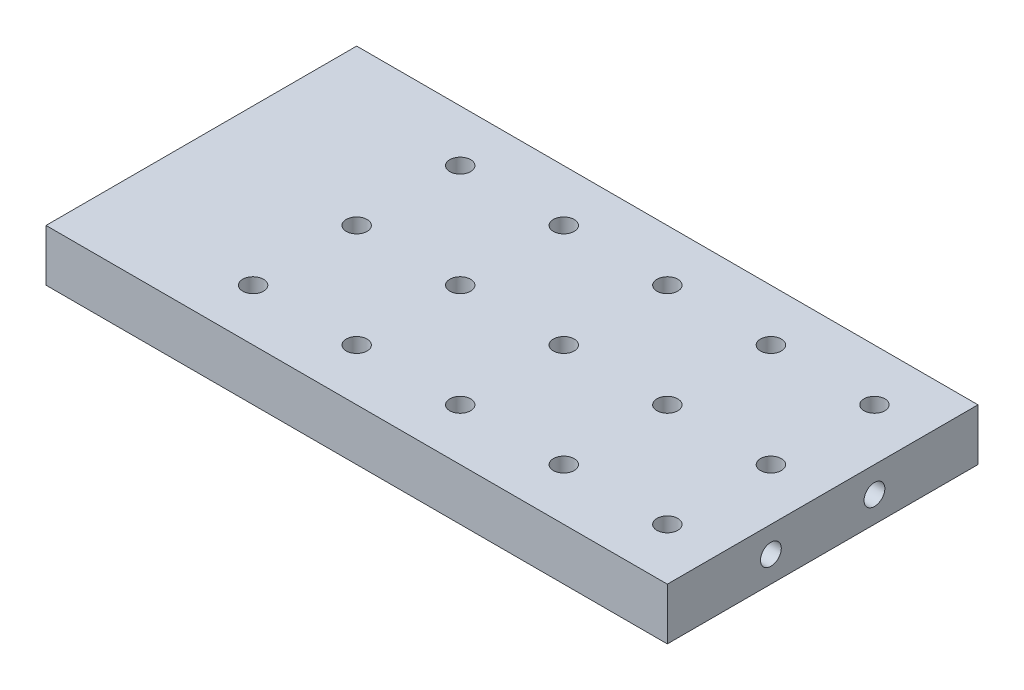
ISO-10303-21;
HEADER;
FILE_DESCRIPTION(('STEP AP214'),'2;1');
FILE_NAME('part.step','',(''),(''),'','','');
FILE_SCHEMA(('AUTOMOTIVE_DESIGN { 1 0 10303 214 1 1 1 1 }'));
ENDSEC;
DATA;
#1=APPLICATION_CONTEXT('core data for automotive mechanical design processes');
#2=APPLICATION_PROTOCOL_DEFINITION('international standard','automotive_design',2000,#1);
#3=PRODUCT_CONTEXT('',#1,'mechanical');
#4=PRODUCT('Part','Part','',(#3));
#5=PRODUCT_RELATED_PRODUCT_CATEGORY('part','',(#4));
#6=PRODUCT_DEFINITION_FORMATION('','',#4);
#7=PRODUCT_DEFINITION_CONTEXT('part definition',#1,'design');
#8=PRODUCT_DEFINITION('design','',#6,#7);
#9=PRODUCT_DEFINITION_SHAPE('','',#8);
#10=(LENGTH_UNIT() NAMED_UNIT(*) SI_UNIT(.MILLI.,.METRE.));
#11=(NAMED_UNIT(*) PLANE_ANGLE_UNIT() SI_UNIT($,.RADIAN.));
#12=(NAMED_UNIT(*) SI_UNIT($,.STERADIAN.) SOLID_ANGLE_UNIT());
#13=UNCERTAINTY_MEASURE_WITH_UNIT(LENGTH_MEASURE(1.E-05),#10,'distance_accuracy_value','');
#14=(GEOMETRIC_REPRESENTATION_CONTEXT(3) GLOBAL_UNCERTAINTY_ASSIGNED_CONTEXT((#13)) GLOBAL_UNIT_ASSIGNED_CONTEXT((#10,
#11,#12)) REPRESENTATION_CONTEXT('',''));
#15=CARTESIAN_POINT('',(0.,0.,0.));
#16=DIRECTION('',(0.,0.,1.));
#17=DIRECTION('',(1.,0.,0.));
#18=AXIS2_PLACEMENT_3D('',#15,#16,#17);
#19=CARTESIAN_POINT('',(0.,6.35,0.));
#20=DIRECTION('',(0.,-1.,0.));
#21=DIRECTION('',(0.,0.,-1.));
#22=AXIS2_PLACEMENT_3D('',#19,#20,#21);
#23=PLANE('',#22);
#24=CARTESIAN_POINT('',(63.5,6.35,-25.4));
#25=DIRECTION('',(0.,1.,0.));
#26=DIRECTION('',(0.,0.,1.));
#27=AXIS2_PLACEMENT_3D('',#24,#25,#26);
#28=CIRCLE('',#27,2.55270000000001);
#29=CARTESIAN_POINT('',(63.5,6.35,-22.8473));
#30=VERTEX_POINT('',#29);
#31=EDGE_CURVE('E133',#30,#30,#28,.T.);
#32=ORIENTED_EDGE('',*,*,#31,.F.);
#33=EDGE_LOOP('',(#32));
#34=FACE_BOUND('',#33,.T.);
#35=CARTESIAN_POINT('',(38.1,6.35,-25.3999999999998));
#36=DIRECTION('',(0.,1.,0.));
#37=DIRECTION('',(0.,0.,1.));
#38=AXIS2_PLACEMENT_3D('',#35,#36,#37);
#39=CIRCLE('',#38,2.5527);
#40=CARTESIAN_POINT('',(38.1,6.35,-22.8472999999998));
#41=VERTEX_POINT('',#40);
#42=EDGE_CURVE('E139',#41,#41,#39,.T.);
#43=ORIENTED_EDGE('',*,*,#42,.F.);
#44=EDGE_LOOP('',(#43));
#45=FACE_BOUND('',#44,.T.);
#46=CARTESIAN_POINT('',(12.7,6.35,-25.3999999999996));
#47=DIRECTION('',(0.,1.,0.));
#48=DIRECTION('',(0.,0.,1.));
#49=AXIS2_PLACEMENT_3D('',#46,#47,#48);
#50=CIRCLE('',#49,2.5527);
#51=CARTESIAN_POINT('',(12.7,6.35,-22.8472999999996));
#52=VERTEX_POINT('',#51);
#53=EDGE_CURVE('E145',#52,#52,#50,.T.);
#54=ORIENTED_EDGE('',*,*,#53,.F.);
#55=EDGE_LOOP('',(#54));
#56=FACE_BOUND('',#55,.T.);
#57=CARTESIAN_POINT('',(38.1000000000003,6.35,1.76941794549634E-13));
#58=DIRECTION('',(0.,1.,0.));
#59=DIRECTION('',(0.,0.,1.));
#60=AXIS2_PLACEMENT_3D('',#57,#58,#59);
#61=CIRCLE('',#60,2.5527);
#62=CARTESIAN_POINT('',(38.1000000000003,6.35,2.55270000000018));
#63=VERTEX_POINT('',#62);
#64=EDGE_CURVE('E151',#63,#63,#61,.T.);
#65=ORIENTED_EDGE('',*,*,#64,.F.);
#66=EDGE_LOOP('',(#65));
#67=FACE_BOUND('',#66,.T.);
#68=CARTESIAN_POINT('',(12.7000000000003,6.35,3.53883589099269E-13));
#69=DIRECTION('',(0.,1.,0.));
#70=DIRECTION('',(0.,0.,1.));
#71=AXIS2_PLACEMENT_3D('',#68,#69,#70);
#72=CIRCLE('',#71,2.5527);
#73=CARTESIAN_POINT('',(12.7000000000003,6.35,2.55270000000035));
#74=VERTEX_POINT('',#73);
#75=EDGE_CURVE('E157',#74,#74,#72,.T.);
#76=ORIENTED_EDGE('',*,*,#75,.F.);
#77=EDGE_LOOP('',(#76));
#78=FACE_BOUND('',#77,.T.);
#79=CARTESIAN_POINT('',(38.1000000000005,6.35,25.4000000000002));
#80=DIRECTION('',(0.,1.,0.));
#81=DIRECTION('',(0.,0.,1.));
#82=AXIS2_PLACEMENT_3D('',#79,#80,#81);
#83=CIRCLE('',#82,2.5527);
#84=CARTESIAN_POINT('',(38.1000000000005,6.35,27.9527000000002));
#85=VERTEX_POINT('',#84);
#86=EDGE_CURVE('E163',#85,#85,#83,.T.);
#87=ORIENTED_EDGE('',*,*,#86,.F.);
#88=EDGE_LOOP('',(#87));
#89=FACE_BOUND('',#88,.T.);
#90=CARTESIAN_POINT('',(12.7000000000005,6.35,25.4000000000004));
#91=DIRECTION('',(0.,1.,0.));
#92=DIRECTION('',(0.,0.,1.));
#93=AXIS2_PLACEMENT_3D('',#90,#91,#92);
#94=CIRCLE('',#93,2.5527);
#95=CARTESIAN_POINT('',(12.7000000000005,6.35,27.9527000000004));
#96=VERTEX_POINT('',#95);
#97=EDGE_CURVE('E169',#96,#96,#94,.T.);
#98=ORIENTED_EDGE('',*,*,#97,.F.);
#99=EDGE_LOOP('',(#98));
#100=FACE_BOUND('',#99,.T.);
#101=CARTESIAN_POINT('',(63.5000000000002,6.35,0.));
#102=DIRECTION('',(0.,1.,0.));
#103=DIRECTION('',(0.,0.,1.));
#104=AXIS2_PLACEMENT_3D('',#101,#102,#103);
#105=CIRCLE('',#104,2.55270000000001);
#106=CARTESIAN_POINT('',(63.5000000000002,6.35,2.55270000000001));
#107=VERTEX_POINT('',#106);
#108=EDGE_CURVE('E175',#107,#107,#105,.T.);
#109=ORIENTED_EDGE('',*,*,#108,.F.);
#110=EDGE_LOOP('',(#109));
#111=FACE_BOUND('',#110,.T.);
#112=CARTESIAN_POINT('',(63.5000000000005,6.35,25.4));
#113=DIRECTION('',(0.,1.,0.));
#114=DIRECTION('',(0.,0.,1.));
#115=AXIS2_PLACEMENT_3D('',#112,#113,#114);
#116=CIRCLE('',#115,2.55270000000001);
#117=CARTESIAN_POINT('',(63.5000000000005,6.35,27.9527));
#118=VERTEX_POINT('',#117);
#119=EDGE_CURVE('E181',#118,#118,#116,.T.);
#120=ORIENTED_EDGE('',*,*,#119,.F.);
#121=EDGE_LOOP('',(#120));
#122=FACE_BOUND('',#121,.T.);
#123=CARTESIAN_POINT('',(-12.7,6.35,-25.3999999999995));
#124=DIRECTION('',(0.,1.,0.));
#125=DIRECTION('',(0.,0.,1.));
#126=AXIS2_PLACEMENT_3D('',#123,#124,#125);
#127=CIRCLE('',#126,2.5527);
#128=CARTESIAN_POINT('',(-12.7,6.35,-22.8472999999995));
#129=VERTEX_POINT('',#128);
#130=EDGE_CURVE('E187',#129,#129,#127,.T.);
#131=ORIENTED_EDGE('',*,*,#130,.F.);
#132=EDGE_LOOP('',(#131));
#133=FACE_BOUND('',#132,.T.);
#134=CARTESIAN_POINT('',(-12.6999999999997,6.35,5.30825383648903E-13));
#135=DIRECTION('',(0.,1.,0.));
#136=DIRECTION('',(0.,0.,1.));
#137=AXIS2_PLACEMENT_3D('',#134,#135,#136);
#138=CIRCLE('',#137,2.5527);
#139=CARTESIAN_POINT('',(-12.6999999999997,6.35,2.55270000000053));
#140=VERTEX_POINT('',#139);
#141=EDGE_CURVE('E199',#140,#140,#138,.T.);
#142=ORIENTED_EDGE('',*,*,#141,.F.);
#143=EDGE_LOOP('',(#142));
#144=FACE_BOUND('',#143,.T.);
#145=CARTESIAN_POINT('',(-38.0999999999997,6.35,7.07767178198537E-13));
#146=DIRECTION('',(0.,1.,0.));
#147=DIRECTION('',(0.,0.,1.));
#148=AXIS2_PLACEMENT_3D('',#145,#146,#147);
#149=CIRCLE('',#148,2.5527);
#150=CARTESIAN_POINT('',(-38.0999999999997,6.35,2.55270000000071));
#151=VERTEX_POINT('',#150);
#152=EDGE_CURVE('E205',#151,#151,#149,.T.);
#153=ORIENTED_EDGE('',*,*,#152,.F.);
#154=EDGE_LOOP('',(#153));
#155=FACE_BOUND('',#154,.T.);
#156=CARTESIAN_POINT('',(-12.6999999999995,6.35,25.4000000000005));
#157=DIRECTION('',(0.,1.,0.));
#158=DIRECTION('',(0.,0.,1.));
#159=AXIS2_PLACEMENT_3D('',#156,#157,#158);
#160=CIRCLE('',#159,2.5527);
#161=CARTESIAN_POINT('',(-12.6999999999995,6.35,27.9527000000005));
#162=VERTEX_POINT('',#161);
#163=EDGE_CURVE('E211',#162,#162,#160,.T.);
#164=ORIENTED_EDGE('',*,*,#163,.F.);
#165=EDGE_LOOP('',(#164));
#166=FACE_BOUND('',#165,.T.);
#167=CARTESIAN_POINT('',(-38.0999999999995,6.35,25.4000000000007));
#168=DIRECTION('',(0.,1.,0.));
#169=DIRECTION('',(0.,0.,1.));
#170=AXIS2_PLACEMENT_3D('',#167,#168,#169);
#171=CIRCLE('',#170,2.5527);
#172=CARTESIAN_POINT('',(-38.0999999999995,6.35,27.9527000000007));
#173=VERTEX_POINT('',#172);
#174=EDGE_CURVE('E217',#173,#173,#171,.T.);
#175=ORIENTED_EDGE('',*,*,#174,.F.);
#176=EDGE_LOOP('',(#175));
#177=FACE_BOUND('',#176,.T.);
#178=DIRECTION('',(0.,0.,-1.));
#179=VECTOR('',#178,1.);
#180=CARTESIAN_POINT('',(76.2,6.35,38.1));
#181=LINE('',#180,#179);
#182=CARTESIAN_POINT('',(76.2,6.35,38.1));
#183=VERTEX_POINT('',#182);
#184=CARTESIAN_POINT('',(76.2,6.35,-38.1));
#185=VERTEX_POINT('',#184);
#186=EDGE_CURVE('E224',#183,#185,#181,.T.);
#187=ORIENTED_EDGE('',*,*,#186,.T.);
#188=DIRECTION('',(-1.,0.,0.));
#189=VECTOR('',#188,1.);
#190=CARTESIAN_POINT('',(-76.2,6.35,-38.1));
#191=LINE('',#190,#189);
#192=CARTESIAN_POINT('',(-76.2,6.35,-38.1));
#193=VERTEX_POINT('',#192);
#194=EDGE_CURVE('E78',#185,#193,#191,.T.);
#195=ORIENTED_EDGE('',*,*,#194,.T.);
#196=DIRECTION('',(0.,0.,1.));
#197=VECTOR('',#196,1.);
#198=CARTESIAN_POINT('',(-76.2,6.35,38.1));
#199=LINE('',#198,#197);
#200=CARTESIAN_POINT('',(-76.2,6.35,38.1));
#201=VERTEX_POINT('',#200);
#202=EDGE_CURVE('E227',#193,#201,#199,.T.);
#203=ORIENTED_EDGE('',*,*,#202,.T.);
#204=DIRECTION('',(1.,0.,0.));
#205=VECTOR('',#204,1.);
#206=CARTESIAN_POINT('',(-76.2,6.35,38.1));
#207=LINE('',#206,#205);
#208=EDGE_CURVE('E47',#201,#183,#207,.T.);
#209=ORIENTED_EDGE('',*,*,#208,.T.);
#210=EDGE_LOOP('',(#187,#195,#203,#209));
#211=FACE_BOUND('',#210,.T.);
#212=CARTESIAN_POINT('',(-38.1,6.35,-25.3999999999993));
#213=DIRECTION('',(0.,1.,0.));
#214=DIRECTION('',(0.,0.,1.));
#215=AXIS2_PLACEMENT_3D('',#212,#213,#214);
#216=CIRCLE('',#215,2.5527);
#217=CARTESIAN_POINT('',(-38.1,6.35,-22.8472999999993));
#218=VERTEX_POINT('',#217);
#219=EDGE_CURVE('E193',#218,#218,#216,.T.);
#220=ORIENTED_EDGE('',*,*,#219,.F.);
#221=EDGE_LOOP('',(#220));
#222=FACE_BOUND('',#221,.T.);
#223=ADVANCED_FACE('F30',(#34,#45,#56,#67,#78,#89,#100,#111,#122,#133,#144,#155,#166,#177,#211,
#222),#23,.F.);
#224=CARTESIAN_POINT('',(76.2,6.35,38.1));
#225=DIRECTION('',(-1.,0.,0.));
#226=DIRECTION('',(0.,0.,1.));
#227=AXIS2_PLACEMENT_3D('',#224,#225,#226);
#228=PLANE('',#227);
#229=CARTESIAN_POINT('',(76.2,0.,-12.7));
#230=DIRECTION('',(1.,0.,0.));
#231=DIRECTION('',(0.,0.,-1.));
#232=AXIS2_PLACEMENT_3D('',#229,#230,#231);
#233=CIRCLE('',#232,2.55269999999999);
#234=CARTESIAN_POINT('',(76.2,0.,-15.2527));
#235=VERTEX_POINT('',#234);
#236=EDGE_CURVE('E105',#235,#235,#233,.T.);
#237=ORIENTED_EDGE('',*,*,#236,.F.);
#238=EDGE_LOOP('',(#237));
#239=FACE_BOUND('',#238,.T.);
#240=CARTESIAN_POINT('',(76.2,0.,12.7));
#241=DIRECTION('',(1.,0.,0.));
#242=DIRECTION('',(0.,0.,-1.));
#243=AXIS2_PLACEMENT_3D('',#240,#241,#242);
#244=CIRCLE('',#243,2.55269999999999);
#245=CARTESIAN_POINT('',(76.2,0.,10.1473));
#246=VERTEX_POINT('',#245);
#247=EDGE_CURVE('E104',#246,#246,#244,.T.);
#248=ORIENTED_EDGE('',*,*,#247,.F.);
#249=EDGE_LOOP('',(#248));
#250=FACE_BOUND('',#249,.T.);
#251=DIRECTION('',(0.,0.,-1.));
#252=VECTOR('',#251,1.);
#253=CARTESIAN_POINT('',(76.2,-6.35,38.1));
#254=LINE('',#253,#252);
#255=CARTESIAN_POINT('',(76.2,-6.35,38.1));
#256=VERTEX_POINT('',#255);
#257=CARTESIAN_POINT('',(76.2,-6.35,-38.1));
#258=VERTEX_POINT('',#257);
#259=EDGE_CURVE('E223',#256,#258,#254,.T.);
#260=ORIENTED_EDGE('',*,*,#259,.T.);
#261=DIRECTION('',(0.,-1.,0.));
#262=VECTOR('',#261,1.);
#263=CARTESIAN_POINT('',(76.2,6.35,-38.1));
#264=LINE('',#263,#262);
#265=EDGE_CURVE('E11',#185,#258,#264,.T.);
#266=ORIENTED_EDGE('',*,*,#265,.F.);
#267=ORIENTED_EDGE('',*,*,#186,.F.);
#268=DIRECTION('',(0.,-1.,0.));
#269=VECTOR('',#268,1.);
#270=CARTESIAN_POINT('',(76.2,6.35,38.1));
#271=LINE('',#270,#269);
#272=EDGE_CURVE('E230',#183,#256,#271,.T.);
#273=ORIENTED_EDGE('',*,*,#272,.T.);
#274=EDGE_LOOP('',(#260,#266,#267,#273));
#275=FACE_BOUND('',#274,.T.);
#276=ADVANCED_FACE('F32',(#239,#250,#275),#228,.F.);
#277=CARTESIAN_POINT('',(-76.2,6.35,-38.1));
#278=DIRECTION('',(0.,0.,1.));
#279=DIRECTION('',(1.,0.,0.));
#280=AXIS2_PLACEMENT_3D('',#277,#278,#279);
#281=PLANE('',#280);
#282=DIRECTION('',(-1.,0.,0.));
#283=VECTOR('',#282,1.);
#284=CARTESIAN_POINT('',(-76.2,-6.35,-38.1));
#285=LINE('',#284,#283);
#286=CARTESIAN_POINT('',(-76.2,-6.35,-38.1));
#287=VERTEX_POINT('',#286);
#288=EDGE_CURVE('E233',#258,#287,#285,.T.);
#289=ORIENTED_EDGE('',*,*,#288,.T.);
#290=DIRECTION('',(0.,-1.,0.));
#291=VECTOR('',#290,1.);
#292=CARTESIAN_POINT('',(-76.2,6.35,-38.1));
#293=LINE('',#292,#291);
#294=EDGE_CURVE('E39',#193,#287,#293,.T.);
#295=ORIENTED_EDGE('',*,*,#294,.F.);
#296=ORIENTED_EDGE('',*,*,#194,.F.);
#297=ORIENTED_EDGE('',*,*,#265,.T.);
#298=EDGE_LOOP('',(#289,#295,#296,#297));
#299=FACE_BOUND('',#298,.T.);
#300=ADVANCED_FACE('F257',(#299),#281,.F.);
#301=CARTESIAN_POINT('',(-76.2,6.35,38.1));
#302=DIRECTION('',(1.,0.,0.));
#303=DIRECTION('',(0.,0.,-1.));
#304=AXIS2_PLACEMENT_3D('',#301,#302,#303);
#305=PLANE('',#304);
#306=CARTESIAN_POINT('',(-76.2,0.,-25.4));
#307=DIRECTION('',(-1.,0.,0.));
#308=DIRECTION('',(0.,0.,1.));
#309=AXIS2_PLACEMENT_3D('',#306,#307,#308);
#310=CIRCLE('',#309,2.55269999999999);
#311=CARTESIAN_POINT('',(-76.2,0.,-22.8473));
#312=VERTEX_POINT('',#311);
#313=EDGE_CURVE('E115',#312,#312,#310,.T.);
#314=ORIENTED_EDGE('',*,*,#313,.F.);
#315=EDGE_LOOP('',(#314));
#316=FACE_BOUND('',#315,.T.);
#317=CARTESIAN_POINT('',(-76.2,0.,0.));
#318=DIRECTION('',(-1.,0.,0.));
#319=DIRECTION('',(0.,0.,1.));
#320=AXIS2_PLACEMENT_3D('',#317,#318,#319);
#321=CIRCLE('',#320,2.55269999999999);
#322=CARTESIAN_POINT('',(-76.2,0.,2.55269999999999));
#323=VERTEX_POINT('',#322);
#324=EDGE_CURVE('E121',#323,#323,#321,.T.);
#325=ORIENTED_EDGE('',*,*,#324,.F.);
#326=EDGE_LOOP('',(#325));
#327=FACE_BOUND('',#326,.T.);
#328=CARTESIAN_POINT('',(-76.2,0.,25.4));
#329=DIRECTION('',(-1.,0.,0.));
#330=DIRECTION('',(0.,0.,1.));
#331=AXIS2_PLACEMENT_3D('',#328,#329,#330);
#332=CIRCLE('',#331,2.55269999999999);
#333=CARTESIAN_POINT('',(-76.2,0.,27.9527));
#334=VERTEX_POINT('',#333);
#335=EDGE_CURVE('E127',#334,#334,#332,.T.);
#336=ORIENTED_EDGE('',*,*,#335,.F.);
#337=EDGE_LOOP('',(#336));
#338=FACE_BOUND('',#337,.T.);
#339=DIRECTION('',(0.,0.,1.));
#340=VECTOR('',#339,1.);
#341=CARTESIAN_POINT('',(-76.2,-6.35,38.1));
#342=LINE('',#341,#340);
#343=CARTESIAN_POINT('',(-76.2,-6.35,38.1));
#344=VERTEX_POINT('',#343);
#345=EDGE_CURVE('E65',#287,#344,#342,.T.);
#346=ORIENTED_EDGE('',*,*,#345,.T.);
#347=DIRECTION('',(0.,-1.,0.));
#348=VECTOR('',#347,1.);
#349=CARTESIAN_POINT('',(-76.2,6.35,38.1));
#350=LINE('',#349,#348);
#351=EDGE_CURVE('E238',#201,#344,#350,.T.);
#352=ORIENTED_EDGE('',*,*,#351,.F.);
#353=ORIENTED_EDGE('',*,*,#202,.F.);
#354=ORIENTED_EDGE('',*,*,#294,.T.);
#355=EDGE_LOOP('',(#346,#352,#353,#354));
#356=FACE_BOUND('',#355,.T.);
#357=ADVANCED_FACE('F240',(#316,#327,#338,#356),#305,.F.);
#358=CARTESIAN_POINT('',(-76.2,6.35,38.1));
#359=DIRECTION('',(0.,0.,-1.));
#360=DIRECTION('',(-1.,0.,0.));
#361=AXIS2_PLACEMENT_3D('',#358,#359,#360);
#362=PLANE('',#361);
#363=DIRECTION('',(1.,0.,0.));
#364=VECTOR('',#363,1.);
#365=CARTESIAN_POINT('',(-76.2,-6.35,38.1));
#366=LINE('',#365,#364);
#367=EDGE_CURVE('E71',#344,#256,#366,.T.);
#368=ORIENTED_EDGE('',*,*,#367,.T.);
#369=ORIENTED_EDGE('',*,*,#272,.F.);
#370=ORIENTED_EDGE('',*,*,#208,.F.);
#371=ORIENTED_EDGE('',*,*,#351,.T.);
#372=EDGE_LOOP('',(#368,#369,#370,#371));
#373=FACE_BOUND('',#372,.T.);
#374=ADVANCED_FACE('F247',(#373),#362,.F.);
#375=CARTESIAN_POINT('',(0.,-6.35,0.));
#376=DIRECTION('',(0.,-1.,0.));
#377=DIRECTION('',(0.,0.,-1.));
#378=AXIS2_PLACEMENT_3D('',#375,#376,#377);
#379=PLANE('',#378);
#380=CARTESIAN_POINT('',(63.5,-6.35,-25.4));
#381=DIRECTION('',(0.,1.,0.));
#382=DIRECTION('',(0.,0.,1.));
#383=AXIS2_PLACEMENT_3D('',#380,#381,#382);
#384=CIRCLE('',#383,2.55269999999999);
#385=CARTESIAN_POINT('',(63.5,-6.35,-22.8473));
#386=VERTEX_POINT('',#385);
#387=EDGE_CURVE('E136',#386,#386,#384,.T.);
#388=ORIENTED_EDGE('',*,*,#387,.T.);
#389=EDGE_LOOP('',(#388));
#390=FACE_BOUND('',#389,.T.);
#391=CARTESIAN_POINT('',(38.1,-6.35,-25.3999999999998));
#392=DIRECTION('',(0.,1.,0.));
#393=DIRECTION('',(0.,0.,1.));
#394=AXIS2_PLACEMENT_3D('',#391,#392,#393);
#395=CIRCLE('',#394,2.5527);
#396=CARTESIAN_POINT('',(38.1,-6.35,-22.8472999999998));
#397=VERTEX_POINT('',#396);
#398=EDGE_CURVE('E142',#397,#397,#395,.T.);
#399=ORIENTED_EDGE('',*,*,#398,.T.);
#400=EDGE_LOOP('',(#399));
#401=FACE_BOUND('',#400,.T.);
#402=CARTESIAN_POINT('',(12.7,-6.35,-25.3999999999996));
#403=DIRECTION('',(0.,1.,0.));
#404=DIRECTION('',(0.,0.,1.));
#405=AXIS2_PLACEMENT_3D('',#402,#403,#404);
#406=CIRCLE('',#405,2.5527);
#407=CARTESIAN_POINT('',(12.7,-6.35,-22.8472999999996));
#408=VERTEX_POINT('',#407);
#409=EDGE_CURVE('E148',#408,#408,#406,.T.);
#410=ORIENTED_EDGE('',*,*,#409,.T.);
#411=EDGE_LOOP('',(#410));
#412=FACE_BOUND('',#411,.T.);
#413=CARTESIAN_POINT('',(38.1000000000003,-6.35,1.76941794549634E-13));
#414=DIRECTION('',(0.,1.,0.));
#415=DIRECTION('',(0.,0.,1.));
#416=AXIS2_PLACEMENT_3D('',#413,#414,#415);
#417=CIRCLE('',#416,2.5527);
#418=CARTESIAN_POINT('',(38.1000000000003,-6.35,2.55270000000018));
#419=VERTEX_POINT('',#418);
#420=EDGE_CURVE('E154',#419,#419,#417,.T.);
#421=ORIENTED_EDGE('',*,*,#420,.T.);
#422=EDGE_LOOP('',(#421));
#423=FACE_BOUND('',#422,.T.);
#424=CARTESIAN_POINT('',(12.7000000000003,-6.35,3.53883589099269E-13));
#425=DIRECTION('',(0.,1.,0.));
#426=DIRECTION('',(0.,0.,1.));
#427=AXIS2_PLACEMENT_3D('',#424,#425,#426);
#428=CIRCLE('',#427,2.5527);
#429=CARTESIAN_POINT('',(12.7000000000003,-6.35,2.55270000000035));
#430=VERTEX_POINT('',#429);
#431=EDGE_CURVE('E160',#430,#430,#428,.T.);
#432=ORIENTED_EDGE('',*,*,#431,.T.);
#433=EDGE_LOOP('',(#432));
#434=FACE_BOUND('',#433,.T.);
#435=CARTESIAN_POINT('',(38.1000000000005,-6.35,25.4000000000002));
#436=DIRECTION('',(0.,1.,0.));
#437=DIRECTION('',(0.,0.,1.));
#438=AXIS2_PLACEMENT_3D('',#435,#436,#437);
#439=CIRCLE('',#438,2.5527);
#440=CARTESIAN_POINT('',(38.1000000000005,-6.35,27.9527000000002));
#441=VERTEX_POINT('',#440);
#442=EDGE_CURVE('E166',#441,#441,#439,.T.);
#443=ORIENTED_EDGE('',*,*,#442,.T.);
#444=EDGE_LOOP('',(#443));
#445=FACE_BOUND('',#444,.T.);
#446=CARTESIAN_POINT('',(12.7000000000005,-6.35,25.4000000000004));
#447=DIRECTION('',(0.,1.,0.));
#448=DIRECTION('',(0.,0.,1.));
#449=AXIS2_PLACEMENT_3D('',#446,#447,#448);
#450=CIRCLE('',#449,2.5527);
#451=CARTESIAN_POINT('',(12.7000000000005,-6.35,27.9527000000004));
#452=VERTEX_POINT('',#451);
#453=EDGE_CURVE('E172',#452,#452,#450,.T.);
#454=ORIENTED_EDGE('',*,*,#453,.T.);
#455=EDGE_LOOP('',(#454));
#456=FACE_BOUND('',#455,.T.);
#457=CARTESIAN_POINT('',(63.5000000000002,-6.35,0.));
#458=DIRECTION('',(0.,1.,0.));
#459=DIRECTION('',(0.,0.,1.));
#460=AXIS2_PLACEMENT_3D('',#457,#458,#459);
#461=CIRCLE('',#460,2.55269999999999);
#462=CARTESIAN_POINT('',(63.5000000000002,-6.35,2.55269999999999));
#463=VERTEX_POINT('',#462);
#464=EDGE_CURVE('E178',#463,#463,#461,.T.);
#465=ORIENTED_EDGE('',*,*,#464,.T.);
#466=EDGE_LOOP('',(#465));
#467=FACE_BOUND('',#466,.T.);
#468=CARTESIAN_POINT('',(63.5000000000005,-6.35,25.4));
#469=DIRECTION('',(0.,1.,0.));
#470=DIRECTION('',(0.,0.,1.));
#471=AXIS2_PLACEMENT_3D('',#468,#469,#470);
#472=CIRCLE('',#471,2.55269999999999);
#473=CARTESIAN_POINT('',(63.5000000000005,-6.35,27.9527));
#474=VERTEX_POINT('',#473);
#475=EDGE_CURVE('E184',#474,#474,#472,.T.);
#476=ORIENTED_EDGE('',*,*,#475,.T.);
#477=EDGE_LOOP('',(#476));
#478=FACE_BOUND('',#477,.T.);
#479=CARTESIAN_POINT('',(-12.7,-6.35,-25.3999999999995));
#480=DIRECTION('',(0.,1.,0.));
#481=DIRECTION('',(0.,0.,1.));
#482=AXIS2_PLACEMENT_3D('',#479,#480,#481);
#483=CIRCLE('',#482,2.5527);
#484=CARTESIAN_POINT('',(-12.7,-6.35,-22.8472999999995));
#485=VERTEX_POINT('',#484);
#486=EDGE_CURVE('E190',#485,#485,#483,.T.);
#487=ORIENTED_EDGE('',*,*,#486,.T.);
#488=EDGE_LOOP('',(#487));
#489=FACE_BOUND('',#488,.T.);
#490=CARTESIAN_POINT('',(-38.1,-6.35,-25.3999999999993));
#491=DIRECTION('',(0.,1.,0.));
#492=DIRECTION('',(0.,0.,1.));
#493=AXIS2_PLACEMENT_3D('',#490,#491,#492);
#494=CIRCLE('',#493,2.5527);
#495=CARTESIAN_POINT('',(-38.1,-6.35,-22.8472999999993));
#496=VERTEX_POINT('',#495);
#497=EDGE_CURVE('E196',#496,#496,#494,.T.);
#498=ORIENTED_EDGE('',*,*,#497,.T.);
#499=EDGE_LOOP('',(#498));
#500=FACE_BOUND('',#499,.T.);
#501=CARTESIAN_POINT('',(-12.6999999999997,-6.35,5.30825383648903E-13));
#502=DIRECTION('',(0.,1.,0.));
#503=DIRECTION('',(0.,0.,1.));
#504=AXIS2_PLACEMENT_3D('',#501,#502,#503);
#505=CIRCLE('',#504,2.5527);
#506=CARTESIAN_POINT('',(-12.6999999999997,-6.35,2.55270000000053));
#507=VERTEX_POINT('',#506);
#508=EDGE_CURVE('E202',#507,#507,#505,.T.);
#509=ORIENTED_EDGE('',*,*,#508,.T.);
#510=EDGE_LOOP('',(#509));
#511=FACE_BOUND('',#510,.T.);
#512=CARTESIAN_POINT('',(-38.0999999999997,-6.35,7.07767178198537E-13));
#513=DIRECTION('',(0.,1.,0.));
#514=DIRECTION('',(0.,0.,1.));
#515=AXIS2_PLACEMENT_3D('',#512,#513,#514);
#516=CIRCLE('',#515,2.5527);
#517=CARTESIAN_POINT('',(-38.0999999999997,-6.35,2.55270000000071));
#518=VERTEX_POINT('',#517);
#519=EDGE_CURVE('E208',#518,#518,#516,.T.);
#520=ORIENTED_EDGE('',*,*,#519,.T.);
#521=EDGE_LOOP('',(#520));
#522=FACE_BOUND('',#521,.T.);
#523=CARTESIAN_POINT('',(-12.6999999999995,-6.35,25.4000000000005));
#524=DIRECTION('',(0.,1.,0.));
#525=DIRECTION('',(0.,0.,1.));
#526=AXIS2_PLACEMENT_3D('',#523,#524,#525);
#527=CIRCLE('',#526,2.5527);
#528=CARTESIAN_POINT('',(-12.6999999999995,-6.35,27.9527000000005));
#529=VERTEX_POINT('',#528);
#530=EDGE_CURVE('E214',#529,#529,#527,.T.);
#531=ORIENTED_EDGE('',*,*,#530,.T.);
#532=EDGE_LOOP('',(#531));
#533=FACE_BOUND('',#532,.T.);
#534=CARTESIAN_POINT('',(-38.0999999999995,-6.35,25.4000000000007));
#535=DIRECTION('',(0.,1.,0.));
#536=DIRECTION('',(0.,0.,1.));
#537=AXIS2_PLACEMENT_3D('',#534,#535,#536);
#538=CIRCLE('',#537,2.5527);
#539=CARTESIAN_POINT('',(-38.0999999999995,-6.35,27.9527000000007));
#540=VERTEX_POINT('',#539);
#541=EDGE_CURVE('E220',#540,#540,#538,.T.);
#542=ORIENTED_EDGE('',*,*,#541,.T.);
#543=EDGE_LOOP('',(#542));
#544=FACE_BOUND('',#543,.T.);
#545=ORIENTED_EDGE('',*,*,#259,.F.);
#546=ORIENTED_EDGE('',*,*,#367,.F.);
#547=ORIENTED_EDGE('',*,*,#345,.F.);
#548=ORIENTED_EDGE('',*,*,#288,.F.);
#549=EDGE_LOOP('',(#545,#546,#547,#548));
#550=FACE_BOUND('',#549,.T.);
#551=ADVANCED_FACE('F243',(#390,#401,#412,#423,#434,#445,#456,#467,#478,#489,#500,#511,#522,
#533,#544,#550),#379,.T.);
#552=CARTESIAN_POINT('',(-38.0999999999995,6.35,25.4000000000007));
#553=DIRECTION('',(0.,1.,0.));
#554=DIRECTION('',(0.,0.,1.));
#555=AXIS2_PLACEMENT_3D('',#552,#553,#554);
#556=CYLINDRICAL_SURFACE('',#555,2.5527);
#557=ORIENTED_EDGE('',*,*,#541,.F.);
#558=EDGE_LOOP('',(#557));
#559=FACE_BOUND('',#558,.T.);
#560=ORIENTED_EDGE('',*,*,#174,.T.);
#561=EDGE_LOOP('',(#560));
#562=FACE_BOUND('',#561,.T.);
#563=ADVANCED_FACE('F254',(#559,#562),#556,.F.);
#564=CARTESIAN_POINT('',(-12.6999999999995,6.35,25.4000000000005));
#565=DIRECTION('',(0.,1.,0.));
#566=DIRECTION('',(0.,0.,1.));
#567=AXIS2_PLACEMENT_3D('',#564,#565,#566);
#568=CYLINDRICAL_SURFACE('',#567,2.5527);
#569=ORIENTED_EDGE('',*,*,#530,.F.);
#570=EDGE_LOOP('',(#569));
#571=FACE_BOUND('',#570,.T.);
#572=ORIENTED_EDGE('',*,*,#163,.T.);
#573=EDGE_LOOP('',(#572));
#574=FACE_BOUND('',#573,.T.);
#575=ADVANCED_FACE('F272',(#571,#574),#568,.F.);
#576=CARTESIAN_POINT('',(-38.0999999999997,6.35,7.07767178198537E-13));
#577=DIRECTION('',(0.,1.,0.));
#578=DIRECTION('',(0.,0.,1.));
#579=AXIS2_PLACEMENT_3D('',#576,#577,#578);
#580=CYLINDRICAL_SURFACE('',#579,2.5527);
#581=ORIENTED_EDGE('',*,*,#519,.F.);
#582=EDGE_LOOP('',(#581));
#583=FACE_BOUND('',#582,.T.);
#584=ORIENTED_EDGE('',*,*,#152,.T.);
#585=EDGE_LOOP('',(#584));
#586=FACE_BOUND('',#585,.T.);
#587=ADVANCED_FACE('F276',(#583,#586),#580,.F.);
#588=CARTESIAN_POINT('',(-12.6999999999997,6.35,5.30825383648903E-13));
#589=DIRECTION('',(0.,1.,0.));
#590=DIRECTION('',(0.,0.,1.));
#591=AXIS2_PLACEMENT_3D('',#588,#589,#590);
#592=CYLINDRICAL_SURFACE('',#591,2.5527);
#593=ORIENTED_EDGE('',*,*,#508,.F.);
#594=EDGE_LOOP('',(#593));
#595=FACE_BOUND('',#594,.T.);
#596=ORIENTED_EDGE('',*,*,#141,.T.);
#597=EDGE_LOOP('',(#596));
#598=FACE_BOUND('',#597,.T.);
#599=ADVANCED_FACE('F280',(#595,#598),#592,.F.);
#600=CARTESIAN_POINT('',(-38.1,6.35,-25.3999999999993));
#601=DIRECTION('',(0.,1.,0.));
#602=DIRECTION('',(0.,0.,1.));
#603=AXIS2_PLACEMENT_3D('',#600,#601,#602);
#604=CYLINDRICAL_SURFACE('',#603,2.5527);
#605=ORIENTED_EDGE('',*,*,#497,.F.);
#606=EDGE_LOOP('',(#605));
#607=FACE_BOUND('',#606,.T.);
#608=ORIENTED_EDGE('',*,*,#219,.T.);
#609=EDGE_LOOP('',(#608));
#610=FACE_BOUND('',#609,.T.);
#611=ADVANCED_FACE('F284',(#607,#610),#604,.F.);
#612=CARTESIAN_POINT('',(-12.7,6.35,-25.3999999999995));
#613=DIRECTION('',(0.,1.,0.));
#614=DIRECTION('',(0.,0.,1.));
#615=AXIS2_PLACEMENT_3D('',#612,#613,#614);
#616=CYLINDRICAL_SURFACE('',#615,2.5527);
#617=ORIENTED_EDGE('',*,*,#486,.F.);
#618=EDGE_LOOP('',(#617));
#619=FACE_BOUND('',#618,.T.);
#620=ORIENTED_EDGE('',*,*,#130,.T.);
#621=EDGE_LOOP('',(#620));
#622=FACE_BOUND('',#621,.T.);
#623=ADVANCED_FACE('F288',(#619,#622),#616,.F.);
#624=CARTESIAN_POINT('',(63.5000000000005,6.35,25.4));
#625=DIRECTION('',(0.,1.,0.));
#626=DIRECTION('',(0.,0.,1.));
#627=AXIS2_PLACEMENT_3D('',#624,#625,#626);
#628=CYLINDRICAL_SURFACE('',#627,2.5527);
#629=ORIENTED_EDGE('',*,*,#475,.F.);
#630=EDGE_LOOP('',(#629));
#631=FACE_BOUND('',#630,.T.);
#632=ORIENTED_EDGE('',*,*,#119,.T.);
#633=EDGE_LOOP('',(#632));
#634=FACE_BOUND('',#633,.T.);
#635=ADVANCED_FACE('F292',(#631,#634),#628,.F.);
#636=CARTESIAN_POINT('',(63.5000000000002,6.35,0.));
#637=DIRECTION('',(0.,1.,0.));
#638=DIRECTION('',(0.,0.,1.));
#639=AXIS2_PLACEMENT_3D('',#636,#637,#638);
#640=CYLINDRICAL_SURFACE('',#639,2.5527);
#641=ORIENTED_EDGE('',*,*,#464,.F.);
#642=EDGE_LOOP('',(#641));
#643=FACE_BOUND('',#642,.T.);
#644=ORIENTED_EDGE('',*,*,#108,.T.);
#645=EDGE_LOOP('',(#644));
#646=FACE_BOUND('',#645,.T.);
#647=ADVANCED_FACE('F296',(#643,#646),#640,.F.);
#648=CARTESIAN_POINT('',(12.7000000000005,6.35,25.4000000000004));
#649=DIRECTION('',(0.,1.,0.));
#650=DIRECTION('',(0.,0.,1.));
#651=AXIS2_PLACEMENT_3D('',#648,#649,#650);
#652=CYLINDRICAL_SURFACE('',#651,2.5527);
#653=ORIENTED_EDGE('',*,*,#453,.F.);
#654=EDGE_LOOP('',(#653));
#655=FACE_BOUND('',#654,.T.);
#656=ORIENTED_EDGE('',*,*,#97,.T.);
#657=EDGE_LOOP('',(#656));
#658=FACE_BOUND('',#657,.T.);
#659=ADVANCED_FACE('F300',(#655,#658),#652,.F.);
#660=CARTESIAN_POINT('',(38.1000000000005,6.35,25.4000000000002));
#661=DIRECTION('',(0.,1.,0.));
#662=DIRECTION('',(0.,0.,1.));
#663=AXIS2_PLACEMENT_3D('',#660,#661,#662);
#664=CYLINDRICAL_SURFACE('',#663,2.5527);
#665=ORIENTED_EDGE('',*,*,#442,.F.);
#666=EDGE_LOOP('',(#665));
#667=FACE_BOUND('',#666,.T.);
#668=ORIENTED_EDGE('',*,*,#86,.T.);
#669=EDGE_LOOP('',(#668));
#670=FACE_BOUND('',#669,.T.);
#671=ADVANCED_FACE('F304',(#667,#670),#664,.F.);
#672=CARTESIAN_POINT('',(12.7000000000003,6.35,3.53883589099269E-13));
#673=DIRECTION('',(0.,1.,0.));
#674=DIRECTION('',(0.,0.,1.));
#675=AXIS2_PLACEMENT_3D('',#672,#673,#674);
#676=CYLINDRICAL_SURFACE('',#675,2.5527);
#677=ORIENTED_EDGE('',*,*,#431,.F.);
#678=EDGE_LOOP('',(#677));
#679=FACE_BOUND('',#678,.T.);
#680=ORIENTED_EDGE('',*,*,#75,.T.);
#681=EDGE_LOOP('',(#680));
#682=FACE_BOUND('',#681,.T.);
#683=ADVANCED_FACE('F308',(#679,#682),#676,.F.);
#684=CARTESIAN_POINT('',(38.1000000000003,6.35,1.76941794549634E-13));
#685=DIRECTION('',(0.,1.,0.));
#686=DIRECTION('',(0.,0.,1.));
#687=AXIS2_PLACEMENT_3D('',#684,#685,#686);
#688=CYLINDRICAL_SURFACE('',#687,2.5527);
#689=ORIENTED_EDGE('',*,*,#420,.F.);
#690=EDGE_LOOP('',(#689));
#691=FACE_BOUND('',#690,.T.);
#692=ORIENTED_EDGE('',*,*,#64,.T.);
#693=EDGE_LOOP('',(#692));
#694=FACE_BOUND('',#693,.T.);
#695=ADVANCED_FACE('F312',(#691,#694),#688,.F.);
#696=CARTESIAN_POINT('',(12.7,6.35,-25.3999999999996));
#697=DIRECTION('',(0.,1.,0.));
#698=DIRECTION('',(0.,0.,1.));
#699=AXIS2_PLACEMENT_3D('',#696,#697,#698);
#700=CYLINDRICAL_SURFACE('',#699,2.5527);
#701=ORIENTED_EDGE('',*,*,#409,.F.);
#702=EDGE_LOOP('',(#701));
#703=FACE_BOUND('',#702,.T.);
#704=ORIENTED_EDGE('',*,*,#53,.T.);
#705=EDGE_LOOP('',(#704));
#706=FACE_BOUND('',#705,.T.);
#707=ADVANCED_FACE('F316',(#703,#706),#700,.F.);
#708=CARTESIAN_POINT('',(38.1,6.35,-25.3999999999998));
#709=DIRECTION('',(0.,1.,0.));
#710=DIRECTION('',(0.,0.,1.));
#711=AXIS2_PLACEMENT_3D('',#708,#709,#710);
#712=CYLINDRICAL_SURFACE('',#711,2.5527);
#713=ORIENTED_EDGE('',*,*,#398,.F.);
#714=EDGE_LOOP('',(#713));
#715=FACE_BOUND('',#714,.T.);
#716=ORIENTED_EDGE('',*,*,#42,.T.);
#717=EDGE_LOOP('',(#716));
#718=FACE_BOUND('',#717,.T.);
#719=ADVANCED_FACE('F320',(#715,#718),#712,.F.);
#720=CARTESIAN_POINT('',(63.5,6.35,-25.4));
#721=DIRECTION('',(0.,1.,0.));
#722=DIRECTION('',(0.,0.,1.));
#723=AXIS2_PLACEMENT_3D('',#720,#721,#722);
#724=CYLINDRICAL_SURFACE('',#723,2.5527);
#725=ORIENTED_EDGE('',*,*,#387,.F.);
#726=EDGE_LOOP('',(#725));
#727=FACE_BOUND('',#726,.T.);
#728=ORIENTED_EDGE('',*,*,#31,.T.);
#729=EDGE_LOOP('',(#728));
#730=FACE_BOUND('',#729,.T.);
#731=ADVANCED_FACE('F324',(#727,#730),#724,.F.);
#732=CARTESIAN_POINT('',(-63.5,0.,25.4));
#733=DIRECTION('',(-1.,0.,0.));
#734=DIRECTION('',(0.,0.,1.));
#735=AXIS2_PLACEMENT_3D('',#732,#733,#734);
#736=CONICAL_SURFACE('',#735,2.5527,1.02974425867665);
#737=CARTESIAN_POINT('',(-61.9661830978084,0.,25.4));
#738=VERTEX_POINT('',#737);
#739=VERTEX_LOOP('',#738);
#740=FACE_BOUND('',#739,.T.);
#741=CARTESIAN_POINT('',(-63.5,0.,25.4));
#742=DIRECTION('',(-1.,0.,0.));
#743=DIRECTION('',(0.,0.,1.));
#744=AXIS2_PLACEMENT_3D('',#741,#742,#743);
#745=CIRCLE('',#744,2.5527);
#746=CARTESIAN_POINT('',(-63.5,0.,27.9527));
#747=VERTEX_POINT('',#746);
#748=EDGE_CURVE('E130',#747,#747,#745,.T.);
#749=ORIENTED_EDGE('',*,*,#748,.T.);
#750=EDGE_LOOP('',(#749));
#751=FACE_BOUND('',#750,.T.);
#752=ADVANCED_FACE('F328',(#740,#751),#736,.F.);
#753=CARTESIAN_POINT('',(-76.2,0.,25.4));
#754=DIRECTION('',(-1.,0.,0.));
#755=DIRECTION('',(0.,0.,1.));
#756=AXIS2_PLACEMENT_3D('',#753,#754,#755);
#757=CYLINDRICAL_SURFACE('',#756,2.55269999999999);
#758=ORIENTED_EDGE('',*,*,#748,.F.);
#759=EDGE_LOOP('',(#758));
#760=FACE_BOUND('',#759,.T.);
#761=ORIENTED_EDGE('',*,*,#335,.T.);
#762=EDGE_LOOP('',(#761));
#763=FACE_BOUND('',#762,.T.);
#764=ADVANCED_FACE('F332',(#760,#763),#757,.F.);
#765=CARTESIAN_POINT('',(-63.5,0.,0.));
#766=DIRECTION('',(-1.,0.,0.));
#767=DIRECTION('',(0.,0.,1.));
#768=AXIS2_PLACEMENT_3D('',#765,#766,#767);
#769=CONICAL_SURFACE('',#768,2.5527,1.02974425867665);
#770=CARTESIAN_POINT('',(-61.9661830978084,0.,0.));
#771=VERTEX_POINT('',#770);
#772=VERTEX_LOOP('',#771);
#773=FACE_BOUND('',#772,.T.);
#774=CARTESIAN_POINT('',(-63.5,0.,0.));
#775=DIRECTION('',(-1.,0.,0.));
#776=DIRECTION('',(0.,0.,1.));
#777=AXIS2_PLACEMENT_3D('',#774,#775,#776);
#778=CIRCLE('',#777,2.5527);
#779=CARTESIAN_POINT('',(-63.5,0.,2.5527));
#780=VERTEX_POINT('',#779);
#781=EDGE_CURVE('E124',#780,#780,#778,.T.);
#782=ORIENTED_EDGE('',*,*,#781,.T.);
#783=EDGE_LOOP('',(#782));
#784=FACE_BOUND('',#783,.T.);
#785=ADVANCED_FACE('F336',(#773,#784),#769,.F.);
#786=CARTESIAN_POINT('',(-76.2,0.,0.));
#787=DIRECTION('',(-1.,0.,0.));
#788=DIRECTION('',(0.,0.,1.));
#789=AXIS2_PLACEMENT_3D('',#786,#787,#788);
#790=CYLINDRICAL_SURFACE('',#789,2.55269999999999);
#791=ORIENTED_EDGE('',*,*,#781,.F.);
#792=EDGE_LOOP('',(#791));
#793=FACE_BOUND('',#792,.T.);
#794=ORIENTED_EDGE('',*,*,#324,.T.);
#795=EDGE_LOOP('',(#794));
#796=FACE_BOUND('',#795,.T.);
#797=ADVANCED_FACE('F340',(#793,#796),#790,.F.);
#798=CARTESIAN_POINT('',(-63.5,0.,-25.4));
#799=DIRECTION('',(-1.,0.,0.));
#800=DIRECTION('',(0.,0.,1.));
#801=AXIS2_PLACEMENT_3D('',#798,#799,#800);
#802=CONICAL_SURFACE('',#801,2.5527,1.02974425867665);
#803=CARTESIAN_POINT('',(-61.9661830978084,0.,-25.4));
#804=VERTEX_POINT('',#803);
#805=VERTEX_LOOP('',#804);
#806=FACE_BOUND('',#805,.T.);
#807=CARTESIAN_POINT('',(-63.5,0.,-25.4));
#808=DIRECTION('',(-1.,0.,0.));
#809=DIRECTION('',(0.,0.,1.));
#810=AXIS2_PLACEMENT_3D('',#807,#808,#809);
#811=CIRCLE('',#810,2.5527);
#812=CARTESIAN_POINT('',(-63.5,0.,-22.8473));
#813=VERTEX_POINT('',#812);
#814=EDGE_CURVE('E118',#813,#813,#811,.T.);
#815=ORIENTED_EDGE('',*,*,#814,.T.);
#816=EDGE_LOOP('',(#815));
#817=FACE_BOUND('',#816,.T.);
#818=ADVANCED_FACE('F344',(#806,#817),#802,.F.);
#819=CARTESIAN_POINT('',(-76.2,0.,-25.4));
#820=DIRECTION('',(-1.,0.,0.));
#821=DIRECTION('',(0.,0.,1.));
#822=AXIS2_PLACEMENT_3D('',#819,#820,#821);
#823=CYLINDRICAL_SURFACE('',#822,2.55269999999999);
#824=ORIENTED_EDGE('',*,*,#814,.F.);
#825=EDGE_LOOP('',(#824));
#826=FACE_BOUND('',#825,.T.);
#827=ORIENTED_EDGE('',*,*,#313,.T.);
#828=EDGE_LOOP('',(#827));
#829=FACE_BOUND('',#828,.T.);
#830=ADVANCED_FACE('F348',(#826,#829),#823,.F.);
#831=CARTESIAN_POINT('',(63.5,0.,12.7));
#832=DIRECTION('',(1.,0.,0.));
#833=DIRECTION('',(0.,0.,-1.));
#834=AXIS2_PLACEMENT_3D('',#831,#832,#833);
#835=CONICAL_SURFACE('',#834,2.5527,1.02974425867665);
#836=CARTESIAN_POINT('',(61.9661830978083,0.,12.7));
#837=VERTEX_POINT('',#836);
#838=VERTEX_LOOP('',#837);
#839=FACE_BOUND('',#838,.T.);
#840=CARTESIAN_POINT('',(63.5,0.,12.7));
#841=DIRECTION('',(1.,0.,0.));
#842=DIRECTION('',(0.,0.,-1.));
#843=AXIS2_PLACEMENT_3D('',#840,#841,#842);
#844=CIRCLE('',#843,2.5527);
#845=CARTESIAN_POINT('',(63.5,0.,10.1473));
#846=VERTEX_POINT('',#845);
#847=EDGE_CURVE('E108',#846,#846,#844,.T.);
#848=ORIENTED_EDGE('',*,*,#847,.T.);
#849=EDGE_LOOP('',(#848));
#850=FACE_BOUND('',#849,.T.);
#851=ADVANCED_FACE('F352',(#839,#850),#835,.F.);
#852=CARTESIAN_POINT('',(76.2,0.,12.7));
#853=DIRECTION('',(1.,0.,0.));
#854=DIRECTION('',(0.,0.,-1.));
#855=AXIS2_PLACEMENT_3D('',#852,#853,#854);
#856=CYLINDRICAL_SURFACE('',#855,2.55269999999999);
#857=ORIENTED_EDGE('',*,*,#847,.F.);
#858=EDGE_LOOP('',(#857));
#859=FACE_BOUND('',#858,.T.);
#860=ORIENTED_EDGE('',*,*,#247,.T.);
#861=EDGE_LOOP('',(#860));
#862=FACE_BOUND('',#861,.T.);
#863=ADVANCED_FACE('F98',(#859,#862),#856,.F.);
#864=CARTESIAN_POINT('',(63.5,0.,-12.7));
#865=DIRECTION('',(1.,0.,0.));
#866=DIRECTION('',(0.,0.,-1.));
#867=AXIS2_PLACEMENT_3D('',#864,#865,#866);
#868=CONICAL_SURFACE('',#867,2.5527,1.02974425867665);
#869=CARTESIAN_POINT('',(61.9661830978083,0.,-12.7));
#870=VERTEX_POINT('',#869);
#871=VERTEX_LOOP('',#870);
#872=FACE_BOUND('',#871,.T.);
#873=CARTESIAN_POINT('',(63.5,0.,-12.7));
#874=DIRECTION('',(1.,0.,0.));
#875=DIRECTION('',(0.,0.,-1.));
#876=AXIS2_PLACEMENT_3D('',#873,#874,#875);
#877=CIRCLE('',#876,2.5527);
#878=CARTESIAN_POINT('',(63.5,0.,-15.2527));
#879=VERTEX_POINT('',#878);
#880=EDGE_CURVE('E102',#879,#879,#877,.T.);
#881=ORIENTED_EDGE('',*,*,#880,.T.);
#882=EDGE_LOOP('',(#881));
#883=FACE_BOUND('',#882,.T.);
#884=ADVANCED_FACE('F94',(#872,#883),#868,.F.);
#885=CARTESIAN_POINT('',(76.2,0.,-12.7));
#886=DIRECTION('',(1.,0.,0.));
#887=DIRECTION('',(0.,0.,-1.));
#888=AXIS2_PLACEMENT_3D('',#885,#886,#887);
#889=CYLINDRICAL_SURFACE('',#888,2.55269999999999);
#890=ORIENTED_EDGE('',*,*,#880,.F.);
#891=EDGE_LOOP('',(#890));
#892=FACE_BOUND('',#891,.T.);
#893=ORIENTED_EDGE('',*,*,#236,.T.);
#894=EDGE_LOOP('',(#893));
#895=FACE_BOUND('',#894,.T.);
#896=ADVANCED_FACE('F97',(#892,#895),#889,.F.);
#897=CLOSED_SHELL('',(#223,#276,#300,#357,#374,#551,#563,#575,#587,#599,#611,#623,#635,#647,
#659,#671,#683,#695,#707,#719,#731,#752,#764,#785,#797,#818,#830,#851,#863,#884,#896));
#898=MANIFOLD_SOLID_BREP('B2',#897);
#899=ADVANCED_BREP_SHAPE_REPRESENTATION('',(#18,#898),#14);
#900=SHAPE_DEFINITION_REPRESENTATION(#9,#899);
ENDSEC;
END-ISO-10303-21;
